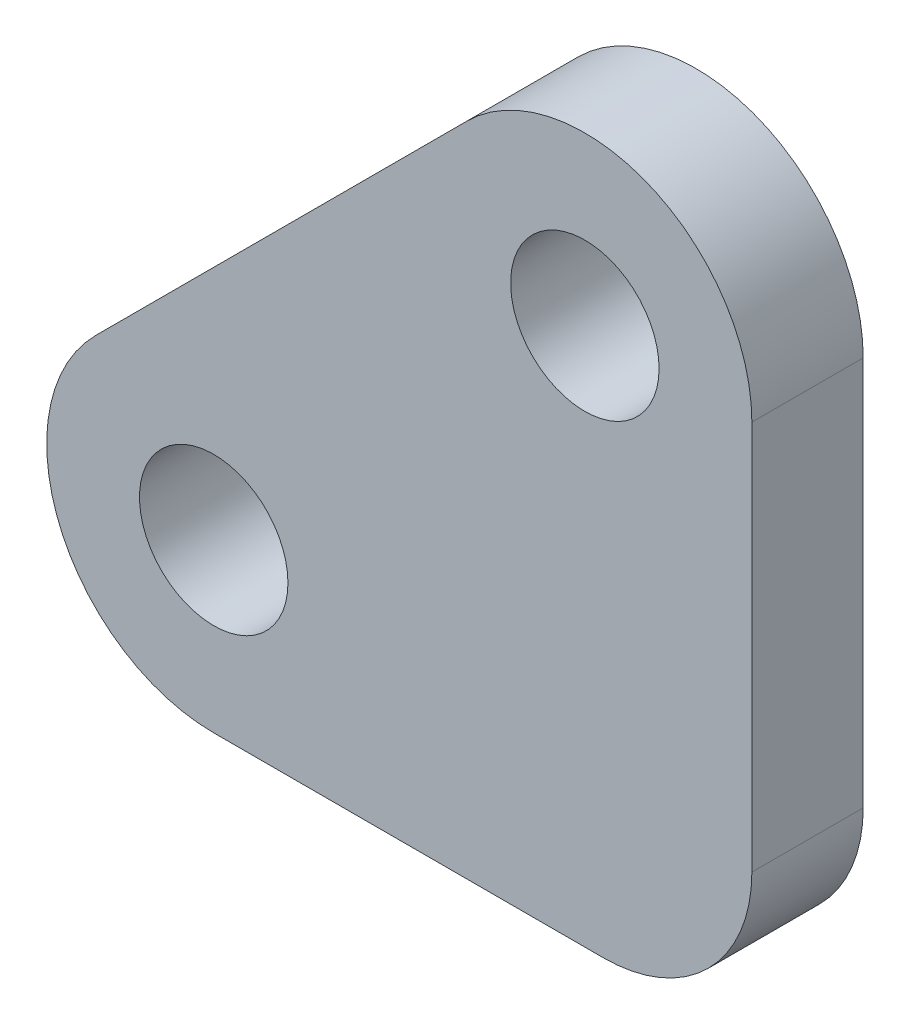
ISO-10303-21;
HEADER;
FILE_DESCRIPTION(('STEP AP214'),'2;1');
FILE_NAME('part.step','',(''),(''),'','','');
FILE_SCHEMA(('AUTOMOTIVE_DESIGN { 1 0 10303 214 1 1 1 1 }'));
ENDSEC;
DATA;
#1=APPLICATION_CONTEXT('core data for automotive mechanical design processes');
#2=APPLICATION_PROTOCOL_DEFINITION('international standard','automotive_design',2000,#1);
#3=PRODUCT_CONTEXT('',#1,'mechanical');
#4=PRODUCT('Part','Part','',(#3));
#5=PRODUCT_RELATED_PRODUCT_CATEGORY('part','',(#4));
#6=PRODUCT_DEFINITION_FORMATION('','',#4);
#7=PRODUCT_DEFINITION_CONTEXT('part definition',#1,'design');
#8=PRODUCT_DEFINITION('design','',#6,#7);
#9=PRODUCT_DEFINITION_SHAPE('','',#8);
#10=(LENGTH_UNIT() NAMED_UNIT(*) SI_UNIT(.MILLI.,.METRE.));
#11=(NAMED_UNIT(*) PLANE_ANGLE_UNIT() SI_UNIT($,.RADIAN.));
#12=(NAMED_UNIT(*) SI_UNIT($,.STERADIAN.) SOLID_ANGLE_UNIT());
#13=UNCERTAINTY_MEASURE_WITH_UNIT(LENGTH_MEASURE(1.E-05),#10,'distance_accuracy_value','');
#14=(GEOMETRIC_REPRESENTATION_CONTEXT(3) GLOBAL_UNCERTAINTY_ASSIGNED_CONTEXT((#13)) GLOBAL_UNIT_ASSIGNED_CONTEXT((#10,
#11,#12)) REPRESENTATION_CONTEXT('',''));
#15=CARTESIAN_POINT('',(0.,0.,0.));
#16=DIRECTION('',(0.,0.,1.));
#17=DIRECTION('',(1.,0.,0.));
#18=AXIS2_PLACEMENT_3D('',#15,#16,#17);
#19=CARTESIAN_POINT('',(-5.,-5.,3.));
#20=DIRECTION('',(0.,0.,1.));
#21=DIRECTION('',(1.,0.,0.));
#22=AXIS2_PLACEMENT_3D('',#19,#20,#21);
#23=PLANE('',#22);
#24=CARTESIAN_POINT('',(5.,5.,3.));
#25=DIRECTION('',(0.,0.,1.));
#26=DIRECTION('',(1.,0.,0.));
#27=AXIS2_PLACEMENT_3D('',#24,#25,#26);
#28=CIRCLE('',#27,2.);
#29=CARTESIAN_POINT('',(7.,5.,3.));
#30=VERTEX_POINT('',#29);
#31=EDGE_CURVE('E129',#30,#30,#28,.T.);
#32=ORIENTED_EDGE('',*,*,#31,.F.);
#33=EDGE_LOOP('',(#32));
#34=FACE_BOUND('',#33,.T.);
#35=DIRECTION('',(1.,0.,0.));
#36=VECTOR('',#35,1.);
#37=CARTESIAN_POINT('',(-5.,-9.5,3.));
#38=LINE('',#37,#36);
#39=CARTESIAN_POINT('',(-5.,-9.5,3.));
#40=VERTEX_POINT('',#39);
#41=CARTESIAN_POINT('',(5.5,-9.5,3.));
#42=VERTEX_POINT('',#41);
#43=EDGE_CURVE('E84',#40,#42,#38,.T.);
#44=ORIENTED_EDGE('',*,*,#43,.T.);
#45=CARTESIAN_POINT('',(5.5,-5.5,3.));
#46=DIRECTION('',(0.,0.,1.));
#47=DIRECTION('',(1.,0.,0.));
#48=AXIS2_PLACEMENT_3D('',#45,#46,#47);
#49=CIRCLE('',#48,4.);
#50=CARTESIAN_POINT('',(9.5,-5.49999999999999,3.));
#51=VERTEX_POINT('',#50);
#52=EDGE_CURVE('E11',#42,#51,#49,.T.);
#53=ORIENTED_EDGE('',*,*,#52,.T.);
#54=DIRECTION('',(0.,1.,0.));
#55=VECTOR('',#54,1.);
#56=CARTESIAN_POINT('',(9.5,5.,3.));
#57=LINE('',#56,#55);
#58=CARTESIAN_POINT('',(9.5,5.,3.));
#59=VERTEX_POINT('',#58);
#60=EDGE_CURVE('E92',#51,#59,#57,.T.);
#61=ORIENTED_EDGE('',*,*,#60,.T.);
#62=CARTESIAN_POINT('',(5.,5.,3.));
#63=DIRECTION('',(0.,0.,1.));
#64=DIRECTION('',(1.,0.,0.));
#65=AXIS2_PLACEMENT_3D('',#62,#63,#64);
#66=CIRCLE('',#65,4.5);
#67=CARTESIAN_POINT('',(1.81801948466054,8.18198051533946,3.));
#68=VERTEX_POINT('',#67);
#69=EDGE_CURVE('E131',#59,#68,#66,.T.);
#70=ORIENTED_EDGE('',*,*,#69,.T.);
#71=DIRECTION('',(-0.707106781186547,-0.707106781186548,0.));
#72=VECTOR('',#71,1.);
#73=CARTESIAN_POINT('',(1.81801948466054,8.18198051533946,3.));
#74=LINE('',#73,#72);
#75=CARTESIAN_POINT('',(-8.18198051533946,-1.81801948466054,3.));
#76=VERTEX_POINT('',#75);
#77=EDGE_CURVE('E98',#68,#76,#74,.T.);
#78=ORIENTED_EDGE('',*,*,#77,.T.);
#79=CARTESIAN_POINT('',(-5.,-5.,3.));
#80=DIRECTION('',(0.,0.,1.));
#81=DIRECTION('',(1.,0.,0.));
#82=AXIS2_PLACEMENT_3D('',#79,#80,#81);
#83=CIRCLE('',#82,4.5);
#84=EDGE_CURVE('E93',#76,#40,#83,.T.);
#85=ORIENTED_EDGE('',*,*,#84,.T.);
#86=EDGE_LOOP('',(#44,#53,#61,#70,#78,#85));
#87=FACE_BOUND('',#86,.T.);
#88=CARTESIAN_POINT('',(-5.,-5.,3.));
#89=DIRECTION('',(0.,0.,1.));
#90=DIRECTION('',(1.,0.,0.));
#91=AXIS2_PLACEMENT_3D('',#88,#89,#90);
#92=CIRCLE('',#91,2.);
#93=CARTESIAN_POINT('',(-3.,-5.,3.));
#94=VERTEX_POINT('',#93);
#95=EDGE_CURVE('E137',#94,#94,#92,.T.);
#96=ORIENTED_EDGE('',*,*,#95,.F.);
#97=EDGE_LOOP('',(#96));
#98=FACE_BOUND('',#97,.T.);
#99=ADVANCED_FACE('F35',(#34,#87,#98),#23,.T.);
#100=CARTESIAN_POINT('',(-5.,-5.,0.));
#101=DIRECTION('',(0.,0.,1.));
#102=DIRECTION('',(1.,0.,0.));
#103=AXIS2_PLACEMENT_3D('',#100,#101,#102);
#104=PLANE('',#103);
#105=CARTESIAN_POINT('',(5.,5.,0.));
#106=DIRECTION('',(0.,0.,1.));
#107=DIRECTION('',(1.,0.,0.));
#108=AXIS2_PLACEMENT_3D('',#105,#106,#107);
#109=CIRCLE('',#108,2.);
#110=CARTESIAN_POINT('',(7.,5.,0.));
#111=VERTEX_POINT('',#110);
#112=EDGE_CURVE('E134',#111,#111,#109,.T.);
#113=ORIENTED_EDGE('',*,*,#112,.T.);
#114=EDGE_LOOP('',(#113));
#115=FACE_BOUND('',#114,.T.);
#116=DIRECTION('',(0.,1.,0.));
#117=VECTOR('',#116,1.);
#118=CARTESIAN_POINT('',(9.5,5.,0.));
#119=LINE('',#118,#117);
#120=CARTESIAN_POINT('',(9.5,-5.49999999999999,0.));
#121=VERTEX_POINT('',#120);
#122=CARTESIAN_POINT('',(9.5,5.,0.));
#123=VERTEX_POINT('',#122);
#124=EDGE_CURVE('E124',#121,#123,#119,.T.);
#125=ORIENTED_EDGE('',*,*,#124,.F.);
#126=CARTESIAN_POINT('',(5.5,-5.5,0.));
#127=DIRECTION('',(0.,0.,1.));
#128=DIRECTION('',(1.,0.,0.));
#129=AXIS2_PLACEMENT_3D('',#126,#127,#128);
#130=CIRCLE('',#129,4.);
#131=CARTESIAN_POINT('',(5.5,-9.5,0.));
#132=VERTEX_POINT('',#131);
#133=EDGE_CURVE('E57',#121,#132,#130,.F.);
#134=ORIENTED_EDGE('',*,*,#133,.T.);
#135=DIRECTION('',(1.,0.,0.));
#136=VECTOR('',#135,1.);
#137=CARTESIAN_POINT('',(-5.,-9.5,0.));
#138=LINE('',#137,#136);
#139=CARTESIAN_POINT('',(-5.,-9.5,0.));
#140=VERTEX_POINT('',#139);
#141=EDGE_CURVE('E126',#140,#132,#138,.T.);
#142=ORIENTED_EDGE('',*,*,#141,.F.);
#143=CARTESIAN_POINT('',(-5.,-5.,0.));
#144=DIRECTION('',(0.,0.,1.));
#145=DIRECTION('',(1.,0.,0.));
#146=AXIS2_PLACEMENT_3D('',#143,#144,#145);
#147=CIRCLE('',#146,4.5);
#148=CARTESIAN_POINT('',(-8.18198051533946,-1.81801948466054,0.));
#149=VERTEX_POINT('',#148);
#150=EDGE_CURVE('E106',#149,#140,#147,.T.);
#151=ORIENTED_EDGE('',*,*,#150,.F.);
#152=DIRECTION('',(-0.707106781186547,-0.707106781186548,0.));
#153=VECTOR('',#152,1.);
#154=CARTESIAN_POINT('',(1.81801948466054,8.18198051533946,0.));
#155=LINE('',#154,#153);
#156=CARTESIAN_POINT('',(1.81801948466054,8.18198051533946,0.));
#157=VERTEX_POINT('',#156);
#158=EDGE_CURVE('E102',#157,#149,#155,.T.);
#159=ORIENTED_EDGE('',*,*,#158,.F.);
#160=CARTESIAN_POINT('',(5.,5.,0.));
#161=DIRECTION('',(0.,0.,1.));
#162=DIRECTION('',(1.,0.,0.));
#163=AXIS2_PLACEMENT_3D('',#160,#161,#162);
#164=CIRCLE('',#163,4.5);
#165=EDGE_CURVE('E122',#123,#157,#164,.T.);
#166=ORIENTED_EDGE('',*,*,#165,.F.);
#167=EDGE_LOOP('',(#125,#134,#142,#151,#159,#166));
#168=FACE_BOUND('',#167,.T.);
#169=CARTESIAN_POINT('',(-5.,-5.,0.));
#170=DIRECTION('',(0.,0.,1.));
#171=DIRECTION('',(1.,0.,0.));
#172=AXIS2_PLACEMENT_3D('',#169,#170,#171);
#173=CIRCLE('',#172,2.);
#174=CARTESIAN_POINT('',(-3.,-5.,0.));
#175=VERTEX_POINT('',#174);
#176=EDGE_CURVE('E140',#175,#175,#173,.T.);
#177=ORIENTED_EDGE('',*,*,#176,.T.);
#178=EDGE_LOOP('',(#177));
#179=FACE_BOUND('',#178,.T.);
#180=ADVANCED_FACE('F149',(#115,#168,#179),#104,.F.);
#181=CARTESIAN_POINT('',(-5.,-5.,3.));
#182=DIRECTION('',(0.,0.,-1.));
#183=DIRECTION('',(-1.,0.,0.));
#184=AXIS2_PLACEMENT_3D('',#181,#182,#183);
#185=CYLINDRICAL_SURFACE('',#184,4.5);
#186=ORIENTED_EDGE('',*,*,#150,.T.);
#187=DIRECTION('',(0.,0.,-1.));
#188=VECTOR('',#187,1.);
#189=CARTESIAN_POINT('',(-5.,-9.5,3.));
#190=LINE('',#189,#188);
#191=EDGE_CURVE('E88',#40,#140,#190,.T.);
#192=ORIENTED_EDGE('',*,*,#191,.F.);
#193=ORIENTED_EDGE('',*,*,#84,.F.);
#194=DIRECTION('',(0.,0.,-1.));
#195=VECTOR('',#194,1.);
#196=CARTESIAN_POINT('',(-8.18198051533946,-1.81801948466054,3.));
#197=LINE('',#196,#195);
#198=EDGE_CURVE('E119',#76,#149,#197,.T.);
#199=ORIENTED_EDGE('',*,*,#198,.T.);
#200=EDGE_LOOP('',(#186,#192,#193,#199));
#201=FACE_BOUND('',#200,.T.);
#202=ADVANCED_FACE('F104',(#201),#185,.T.);
#203=CARTESIAN_POINT('',(-5.,-9.5,3.));
#204=DIRECTION('',(0.,1.,0.));
#205=DIRECTION('',(0.,0.,1.));
#206=AXIS2_PLACEMENT_3D('',#203,#204,#205);
#207=PLANE('',#206);
#208=ORIENTED_EDGE('',*,*,#141,.T.);
#209=DIRECTION('',(0.,0.,-1.));
#210=VECTOR('',#209,1.);
#211=CARTESIAN_POINT('',(5.5,-9.5,3.));
#212=LINE('',#211,#210);
#213=EDGE_CURVE('E43',#132,#42,#212,.F.);
#214=ORIENTED_EDGE('',*,*,#213,.T.);
#215=ORIENTED_EDGE('',*,*,#43,.F.);
#216=ORIENTED_EDGE('',*,*,#191,.T.);
#217=EDGE_LOOP('',(#208,#214,#215,#216));
#218=FACE_BOUND('',#217,.T.);
#219=ADVANCED_FACE('F86',(#218),#207,.F.);
#220=CARTESIAN_POINT('',(9.5,5.,3.));
#221=DIRECTION('',(-1.,0.,0.));
#222=DIRECTION('',(0.,-1.,0.));
#223=AXIS2_PLACEMENT_3D('',#220,#221,#222);
#224=PLANE('',#223);
#225=ORIENTED_EDGE('',*,*,#60,.F.);
#226=DIRECTION('',(0.,0.,-1.));
#227=VECTOR('',#226,1.);
#228=CARTESIAN_POINT('',(9.5,-5.5,3.));
#229=LINE('',#228,#227);
#230=EDGE_CURVE('E107',#51,#121,#229,.T.);
#231=ORIENTED_EDGE('',*,*,#230,.T.);
#232=ORIENTED_EDGE('',*,*,#124,.T.);
#233=DIRECTION('',(0.,0.,-1.));
#234=VECTOR('',#233,1.);
#235=CARTESIAN_POINT('',(9.5,5.,3.));
#236=LINE('',#235,#234);
#237=EDGE_CURVE('E108',#59,#123,#236,.T.);
#238=ORIENTED_EDGE('',*,*,#237,.F.);
#239=EDGE_LOOP('',(#225,#231,#232,#238));
#240=FACE_BOUND('',#239,.T.);
#241=ADVANCED_FACE('F169',(#240),#224,.F.);
#242=CARTESIAN_POINT('',(5.,5.,3.));
#243=DIRECTION('',(0.,0.,-1.));
#244=DIRECTION('',(-1.,0.,0.));
#245=AXIS2_PLACEMENT_3D('',#242,#243,#244);
#246=CYLINDRICAL_SURFACE('',#245,4.5);
#247=ORIENTED_EDGE('',*,*,#165,.T.);
#248=DIRECTION('',(0.,0.,-1.));
#249=VECTOR('',#248,1.);
#250=CARTESIAN_POINT('',(1.81801948466054,8.18198051533946,3.));
#251=LINE('',#250,#249);
#252=EDGE_CURVE('E113',#68,#157,#251,.T.);
#253=ORIENTED_EDGE('',*,*,#252,.F.);
#254=ORIENTED_EDGE('',*,*,#69,.F.);
#255=ORIENTED_EDGE('',*,*,#237,.T.);
#256=EDGE_LOOP('',(#247,#253,#254,#255));
#257=FACE_BOUND('',#256,.T.);
#258=ADVANCED_FACE('F165',(#257),#246,.T.);
#259=CARTESIAN_POINT('',(1.81801948466054,8.18198051533946,3.));
#260=DIRECTION('',(0.707106781186548,-0.707106781186547,0.));
#261=DIRECTION('',(0.707106781186547,0.707106781186548,0.));
#262=AXIS2_PLACEMENT_3D('',#259,#260,#261);
#263=PLANE('',#262);
#264=ORIENTED_EDGE('',*,*,#158,.T.);
#265=ORIENTED_EDGE('',*,*,#198,.F.);
#266=ORIENTED_EDGE('',*,*,#77,.F.);
#267=ORIENTED_EDGE('',*,*,#252,.T.);
#268=EDGE_LOOP('',(#264,#265,#266,#267));
#269=FACE_BOUND('',#268,.T.);
#270=ADVANCED_FACE('F162',(#269),#263,.F.);
#271=CARTESIAN_POINT('',(5.,5.,3.));
#272=DIRECTION('',(0.,0.,-1.));
#273=DIRECTION('',(-1.,0.,0.));
#274=AXIS2_PLACEMENT_3D('',#271,#272,#273);
#275=CYLINDRICAL_SURFACE('',#274,2.);
#276=ORIENTED_EDGE('',*,*,#31,.T.);
#277=EDGE_LOOP('',(#276));
#278=FACE_BOUND('',#277,.T.);
#279=ORIENTED_EDGE('',*,*,#112,.F.);
#280=EDGE_LOOP('',(#279));
#281=FACE_BOUND('',#280,.T.);
#282=ADVANCED_FACE('F159',(#278,#281),#275,.F.);
#283=CARTESIAN_POINT('',(-5.,-5.,3.));
#284=DIRECTION('',(0.,0.,-1.));
#285=DIRECTION('',(-1.,0.,0.));
#286=AXIS2_PLACEMENT_3D('',#283,#284,#285);
#287=CYLINDRICAL_SURFACE('',#286,2.);
#288=ORIENTED_EDGE('',*,*,#95,.T.);
#289=EDGE_LOOP('',(#288));
#290=FACE_BOUND('',#289,.T.);
#291=ORIENTED_EDGE('',*,*,#176,.F.);
#292=EDGE_LOOP('',(#291));
#293=FACE_BOUND('',#292,.T.);
#294=ADVANCED_FACE('F146',(#290,#293),#287,.F.);
#295=CARTESIAN_POINT('',(5.5,-5.5,3.));
#296=DIRECTION('',(0.,0.,-1.));
#297=DIRECTION('',(-1.,0.,0.));
#298=AXIS2_PLACEMENT_3D('',#295,#296,#297);
#299=CYLINDRICAL_SURFACE('',#298,4.);
#300=ORIENTED_EDGE('',*,*,#52,.F.);
#301=ORIENTED_EDGE('',*,*,#213,.F.);
#302=ORIENTED_EDGE('',*,*,#133,.F.);
#303=ORIENTED_EDGE('',*,*,#230,.F.);
#304=EDGE_LOOP('',(#300,#301,#302,#303));
#305=FACE_BOUND('',#304,.T.);
#306=ADVANCED_FACE('F37',(#305),#299,.T.);
#307=CLOSED_SHELL('',(#99,#180,#202,#219,#241,#258,#270,#282,#294,#306));
#308=MANIFOLD_SOLID_BREP('B2',#307);
#309=ADVANCED_BREP_SHAPE_REPRESENTATION('',(#18,#308),#14);
#310=SHAPE_DEFINITION_REPRESENTATION(#9,#309);
ENDSEC;
END-ISO-10303-21;
